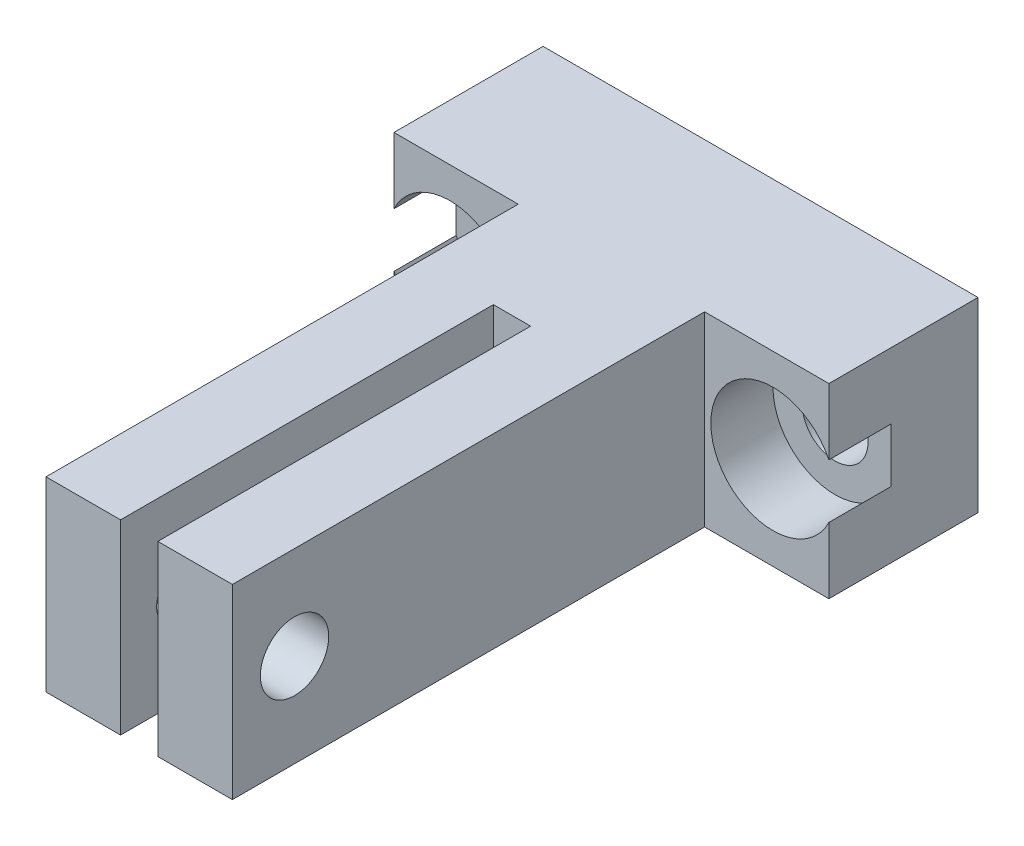
ISO-10303-21;
HEADER;
FILE_DESCRIPTION(('STEP AP214'),'2;1');
FILE_NAME('part.step','',(''),(''),'','','');
FILE_SCHEMA(('AUTOMOTIVE_DESIGN { 1 0 10303 214 1 1 1 1 }'));
ENDSEC;
DATA;
#1=APPLICATION_CONTEXT('core data for automotive mechanical design processes');
#2=APPLICATION_PROTOCOL_DEFINITION('international standard','automotive_design',2000,#1);
#3=PRODUCT_CONTEXT('',#1,'mechanical');
#4=PRODUCT('Part','Part','',(#3));
#5=PRODUCT_RELATED_PRODUCT_CATEGORY('part','',(#4));
#6=PRODUCT_DEFINITION_FORMATION('','',#4);
#7=PRODUCT_DEFINITION_CONTEXT('part definition',#1,'design');
#8=PRODUCT_DEFINITION('design','',#6,#7);
#9=PRODUCT_DEFINITION_SHAPE('','',#8);
#10=(LENGTH_UNIT() NAMED_UNIT(*) SI_UNIT(.MILLI.,.METRE.));
#11=(NAMED_UNIT(*) PLANE_ANGLE_UNIT() SI_UNIT($,.RADIAN.));
#12=(NAMED_UNIT(*) SI_UNIT($,.STERADIAN.) SOLID_ANGLE_UNIT());
#13=UNCERTAINTY_MEASURE_WITH_UNIT(LENGTH_MEASURE(1.E-05),#10,'distance_accuracy_value','');
#14=(GEOMETRIC_REPRESENTATION_CONTEXT(3) GLOBAL_UNCERTAINTY_ASSIGNED_CONTEXT((#13)) GLOBAL_UNIT_ASSIGNED_CONTEXT((#10,
#11,#12)) REPRESENTATION_CONTEXT('',''));
#15=CARTESIAN_POINT('',(0.,0.,0.));
#16=DIRECTION('',(0.,0.,1.));
#17=DIRECTION('',(1.,0.,0.));
#18=AXIS2_PLACEMENT_3D('',#15,#16,#17);
#19=CARTESIAN_POINT('',(0.,0.,12.));
#20=DIRECTION('',(0.,0.,-1.));
#21=DIRECTION('',(-1.,0.,0.));
#22=AXIS2_PLACEMENT_3D('',#19,#20,#21);
#23=PLANE('',#22);
#24=CARTESIAN_POINT('',(-173.,-19.5,12.));
#25=DIRECTION('',(0.,0.,1.));
#26=DIRECTION('',(1.,0.,0.));
#27=AXIS2_PLACEMENT_3D('',#24,#25,#26);
#28=CIRCLE('',#27,5.);
#29=CARTESIAN_POINT('',(-168.5,-17.3205505282297,12.));
#30=VERTEX_POINT('',#29);
#31=CARTESIAN_POINT('',(-168.5,-21.6794494717703,12.));
#32=VERTEX_POINT('',#31);
#33=EDGE_CURVE('E165',#30,#32,#28,.T.);
#34=ORIENTED_EDGE('',*,*,#33,.F.);
#35=DIRECTION('',(0.,-1.,0.));
#36=VECTOR('',#35,1.);
#37=CARTESIAN_POINT('',(-168.5,-27.,12.));
#38=LINE('',#37,#36);
#39=CARTESIAN_POINT('',(-168.5,-12.,12.));
#40=VERTEX_POINT('',#39);
#41=EDGE_CURVE('E232',#40,#30,#38,.T.);
#42=ORIENTED_EDGE('',*,*,#41,.F.);
#43=DIRECTION('',(1.,0.,0.));
#44=VECTOR('',#43,1.);
#45=CARTESIAN_POINT('',(-178.5,-12.,12.));
#46=LINE('',#45,#44);
#47=CARTESIAN_POINT('',(-178.5,-12.,12.));
#48=VERTEX_POINT('',#47);
#49=EDGE_CURVE('E237',#48,#40,#46,.T.);
#50=ORIENTED_EDGE('',*,*,#49,.F.);
#51=DIRECTION('',(0.,1.,0.));
#52=VECTOR('',#51,1.);
#53=CARTESIAN_POINT('',(-178.5,-27.,12.));
#54=LINE('',#53,#52);
#55=CARTESIAN_POINT('',(-178.5,-27.,12.));
#56=VERTEX_POINT('',#55);
#57=EDGE_CURVE('E225',#56,#48,#54,.T.);
#58=ORIENTED_EDGE('',*,*,#57,.F.);
#59=DIRECTION('',(-1.,0.,0.));
#60=VECTOR('',#59,1.);
#61=CARTESIAN_POINT('',(-178.5,-27.,12.));
#62=LINE('',#61,#60);
#63=CARTESIAN_POINT('',(-168.5,-27.,12.));
#64=VERTEX_POINT('',#63);
#65=EDGE_CURVE('E246',#64,#56,#62,.T.);
#66=ORIENTED_EDGE('',*,*,#65,.F.);
#67=EDGE_CURVE('E243',#32,#64,#38,.T.);
#68=ORIENTED_EDGE('',*,*,#67,.F.);
#69=EDGE_LOOP('',(#34,#42,#50,#58,#66,#68));
#70=FACE_BOUND('',#69,.T.);
#71=ADVANCED_FACE('F34',(#70),#23,.F.);
#72=CARTESIAN_POINT('',(0.,0.,50.));
#73=DIRECTION('',(0.,0.,-1.));
#74=DIRECTION('',(-1.,0.,0.));
#75=AXIS2_PLACEMENT_3D('',#72,#73,#74);
#76=PLANE('',#75);
#77=DIRECTION('',(1.,0.,0.));
#78=VECTOR('',#77,1.);
#79=CARTESIAN_POINT('',(-193.5,-27.,50.));
#80=LINE('',#79,#78);
#81=CARTESIAN_POINT('',(-193.5,-27.,50.));
#82=VERTEX_POINT('',#81);
#83=CARTESIAN_POINT('',(-187.5,-27.,50.));
#84=VERTEX_POINT('',#83);
#85=EDGE_CURVE('E272',#82,#84,#80,.T.);
#86=ORIENTED_EDGE('',*,*,#85,.T.);
#87=DIRECTION('',(0.,-1.,0.));
#88=VECTOR('',#87,1.);
#89=CARTESIAN_POINT('',(-187.5,-12.,50.));
#90=LINE('',#89,#88);
#91=CARTESIAN_POINT('',(-187.5,-12.,50.));
#92=VERTEX_POINT('',#91);
#93=EDGE_CURVE('E291',#92,#84,#90,.T.);
#94=ORIENTED_EDGE('',*,*,#93,.F.);
#95=DIRECTION('',(-1.,0.,0.));
#96=VECTOR('',#95,1.);
#97=CARTESIAN_POINT('',(-193.5,-12.,50.));
#98=LINE('',#97,#96);
#99=CARTESIAN_POINT('',(-193.5,-12.,50.));
#100=VERTEX_POINT('',#99);
#101=EDGE_CURVE('E269',#92,#100,#98,.T.);
#102=ORIENTED_EDGE('',*,*,#101,.T.);
#103=DIRECTION('',(0.,-1.,0.));
#104=VECTOR('',#103,1.);
#105=CARTESIAN_POINT('',(-193.5,-27.,50.));
#106=LINE('',#105,#104);
#107=EDGE_CURVE('E262',#100,#82,#106,.T.);
#108=ORIENTED_EDGE('',*,*,#107,.T.);
#109=EDGE_LOOP('',(#86,#94,#102,#108));
#110=FACE_BOUND('',#109,.T.);
#111=ADVANCED_FACE('F338',(#110),#76,.F.);
#112=CARTESIAN_POINT('',(-193.5,-27.,50.));
#113=DIRECTION('',(1.,0.,0.));
#114=DIRECTION('',(0.,0.,-1.));
#115=AXIS2_PLACEMENT_3D('',#112,#113,#114);
#116=PLANE('',#115);
#117=CARTESIAN_POINT('',(-193.5,-19.4999999999997,45.));
#118=DIRECTION('',(1.,0.,0.));
#119=DIRECTION('',(0.,0.,-1.));
#120=AXIS2_PLACEMENT_3D('',#117,#118,#119);
#121=CIRCLE('',#120,2.09999999999999);
#122=CARTESIAN_POINT('',(-193.5,-19.4999999999997,42.9));
#123=VERTEX_POINT('',#122);
#124=EDGE_CURVE('E401',#123,#123,#121,.T.);
#125=ORIENTED_EDGE('',*,*,#124,.T.);
#126=EDGE_LOOP('',(#125));
#127=FACE_BOUND('',#126,.T.);
#128=DIRECTION('',(0.,0.,-1.));
#129=VECTOR('',#128,1.);
#130=CARTESIAN_POINT('',(-193.5,-12.,50.));
#131=LINE('',#130,#129);
#132=CARTESIAN_POINT('',(-193.5,-12.,12.));
#133=VERTEX_POINT('',#132);
#134=EDGE_CURVE('E195',#100,#133,#131,.T.);
#135=ORIENTED_EDGE('',*,*,#134,.T.);
#136=DIRECTION('',(0.,-1.,0.));
#137=VECTOR('',#136,1.);
#138=CARTESIAN_POINT('',(-193.5,-27.,12.));
#139=LINE('',#138,#137);
#140=CARTESIAN_POINT('',(-193.5,-27.,12.));
#141=VERTEX_POINT('',#140);
#142=EDGE_CURVE('E190',#133,#141,#139,.T.);
#143=ORIENTED_EDGE('',*,*,#142,.T.);
#144=DIRECTION('',(0.,0.,-1.));
#145=VECTOR('',#144,1.);
#146=CARTESIAN_POINT('',(-193.5,-27.,50.));
#147=LINE('',#146,#145);
#148=EDGE_CURVE('E207',#82,#141,#147,.T.);
#149=ORIENTED_EDGE('',*,*,#148,.F.);
#150=ORIENTED_EDGE('',*,*,#107,.F.);
#151=EDGE_LOOP('',(#135,#143,#149,#150));
#152=FACE_BOUND('',#151,.T.);
#153=ADVANCED_FACE('F36',(#127,#152),#116,.F.);
#154=CARTESIAN_POINT('',(-193.5,-27.,50.));
#155=DIRECTION('',(0.,1.,0.));
#156=DIRECTION('',(0.,0.,1.));
#157=AXIS2_PLACEMENT_3D('',#154,#155,#156);
#158=PLANE('',#157);
#159=DIRECTION('',(1.,0.,0.));
#160=VECTOR('',#159,1.);
#161=CARTESIAN_POINT('',(-187.5,-27.,20.));
#162=LINE('',#161,#160);
#163=CARTESIAN_POINT('',(-187.5,-27.,20.));
#164=VERTEX_POINT('',#163);
#165=CARTESIAN_POINT('',(-184.5,-27.,20.));
#166=VERTEX_POINT('',#165);
#167=EDGE_CURVE('E299',#164,#166,#162,.T.);
#168=ORIENTED_EDGE('',*,*,#167,.F.);
#169=DIRECTION('',(0.,0.,1.));
#170=VECTOR('',#169,1.);
#171=CARTESIAN_POINT('',(-187.5,-27.,20.));
#172=LINE('',#171,#170);
#173=EDGE_CURVE('E278',#164,#84,#172,.T.);
#174=ORIENTED_EDGE('',*,*,#173,.T.);
#175=ORIENTED_EDGE('',*,*,#85,.F.);
#176=ORIENTED_EDGE('',*,*,#148,.T.);
#177=DIRECTION('',(-1.,0.,0.));
#178=VECTOR('',#177,1.);
#179=CARTESIAN_POINT('',(-193.5,-27.,12.));
#180=LINE('',#179,#178);
#181=CARTESIAN_POINT('',(-203.5,-27.,12.));
#182=VERTEX_POINT('',#181);
#183=EDGE_CURVE('E198',#141,#182,#180,.T.);
#184=ORIENTED_EDGE('',*,*,#183,.T.);
#185=DIRECTION('',(0.,0.,-1.));
#186=VECTOR('',#185,1.);
#187=CARTESIAN_POINT('',(-203.5,-27.,12.));
#188=LINE('',#187,#186);
#189=CARTESIAN_POINT('',(-203.5,-27.,0.));
#190=VERTEX_POINT('',#189);
#191=EDGE_CURVE('E194',#182,#190,#188,.T.);
#192=ORIENTED_EDGE('',*,*,#191,.T.);
#193=DIRECTION('',(1.,0.,0.));
#194=VECTOR('',#193,1.);
#195=CARTESIAN_POINT('',(-193.5,-27.,0.));
#196=LINE('',#195,#194);
#197=CARTESIAN_POINT('',(-168.5,-27.,0.));
#198=VERTEX_POINT('',#197);
#199=EDGE_CURVE('E263',#190,#198,#196,.T.);
#200=ORIENTED_EDGE('',*,*,#199,.T.);
#201=DIRECTION('',(0.,0.,-1.));
#202=VECTOR('',#201,1.);
#203=CARTESIAN_POINT('',(-168.5,-27.,12.));
#204=LINE('',#203,#202);
#205=EDGE_CURVE('E293',#64,#198,#204,.T.);
#206=ORIENTED_EDGE('',*,*,#205,.F.);
#207=ORIENTED_EDGE('',*,*,#65,.T.);
#208=DIRECTION('',(0.,0.,-1.));
#209=VECTOR('',#208,1.);
#210=CARTESIAN_POINT('',(-178.5,-27.,50.));
#211=LINE('',#210,#209);
#212=CARTESIAN_POINT('',(-178.5,-27.,50.));
#213=VERTEX_POINT('',#212);
#214=EDGE_CURVE('E238',#213,#56,#211,.T.);
#215=ORIENTED_EDGE('',*,*,#214,.F.);
#216=CARTESIAN_POINT('',(-184.5,-27.,50.));
#217=VERTEX_POINT('',#216);
#218=EDGE_CURVE('E275',#217,#213,#80,.T.);
#219=ORIENTED_EDGE('',*,*,#218,.F.);
#220=DIRECTION('',(0.,0.,1.));
#221=VECTOR('',#220,1.);
#222=CARTESIAN_POINT('',(-184.5,-27.,20.));
#223=LINE('',#222,#221);
#224=EDGE_CURVE('E281',#166,#217,#223,.T.);
#225=ORIENTED_EDGE('',*,*,#224,.F.);
#226=EDGE_LOOP('',(#168,#174,#175,#176,#184,#192,#200,#206,#207,#215,#219,#225));
#227=FACE_BOUND('',#226,.T.);
#228=ADVANCED_FACE('F371',(#227),#158,.F.);
#229=CARTESIAN_POINT('',(-178.5,-27.,50.));
#230=DIRECTION('',(-1.,0.,0.));
#231=DIRECTION('',(0.,0.,1.));
#232=AXIS2_PLACEMENT_3D('',#229,#230,#231);
#233=PLANE('',#232);
#234=CARTESIAN_POINT('',(-178.5,-19.5,45.));
#235=DIRECTION('',(1.,0.,0.));
#236=DIRECTION('',(0.,0.,-1.));
#237=AXIS2_PLACEMENT_3D('',#234,#235,#236);
#238=CIRCLE('',#237,2.75);
#239=CARTESIAN_POINT('',(-178.5,-19.5,42.25));
#240=VERTEX_POINT('',#239);
#241=EDGE_CURVE('E159',#240,#240,#238,.T.);
#242=ORIENTED_EDGE('',*,*,#241,.F.);
#243=EDGE_LOOP('',(#242));
#244=FACE_BOUND('',#243,.T.);
#245=ORIENTED_EDGE('',*,*,#214,.T.);
#246=ORIENTED_EDGE('',*,*,#57,.T.);
#247=DIRECTION('',(0.,0.,-1.));
#248=VECTOR('',#247,1.);
#249=CARTESIAN_POINT('',(-178.5,-12.,50.));
#250=LINE('',#249,#248);
#251=CARTESIAN_POINT('',(-178.5,-12.,50.));
#252=VERTEX_POINT('',#251);
#253=EDGE_CURVE('E256',#252,#48,#250,.T.);
#254=ORIENTED_EDGE('',*,*,#253,.F.);
#255=DIRECTION('',(0.,1.,0.));
#256=VECTOR('',#255,1.);
#257=CARTESIAN_POINT('',(-178.5,-27.,50.));
#258=LINE('',#257,#256);
#259=EDGE_CURVE('E270',#213,#252,#258,.T.);
#260=ORIENTED_EDGE('',*,*,#259,.F.);
#261=EDGE_LOOP('',(#245,#246,#254,#260));
#262=FACE_BOUND('',#261,.T.);
#263=ADVANCED_FACE('F369',(#244,#262),#233,.F.);
#264=CARTESIAN_POINT('',(-193.5,-12.,50.));
#265=DIRECTION('',(0.,-1.,0.));
#266=DIRECTION('',(1.,0.,0.));
#267=AXIS2_PLACEMENT_3D('',#264,#265,#266);
#268=PLANE('',#267);
#269=ORIENTED_EDGE('',*,*,#101,.F.);
#270=DIRECTION('',(0.,0.,1.));
#271=VECTOR('',#270,1.);
#272=CARTESIAN_POINT('',(-187.5,-12.,20.));
#273=LINE('',#272,#271);
#274=CARTESIAN_POINT('',(-187.5,-12.,20.));
#275=VERTEX_POINT('',#274);
#276=EDGE_CURVE('E265',#275,#92,#273,.T.);
#277=ORIENTED_EDGE('',*,*,#276,.F.);
#278=DIRECTION('',(-1.,0.,0.));
#279=VECTOR('',#278,1.);
#280=CARTESIAN_POINT('',(-187.5,-12.,20.));
#281=LINE('',#280,#279);
#282=CARTESIAN_POINT('',(-184.5,-12.,20.));
#283=VERTEX_POINT('',#282);
#284=EDGE_CURVE('E282',#283,#275,#281,.T.);
#285=ORIENTED_EDGE('',*,*,#284,.F.);
#286=DIRECTION('',(0.,0.,1.));
#287=VECTOR('',#286,1.);
#288=CARTESIAN_POINT('',(-184.5,-12.,20.));
#289=LINE('',#288,#287);
#290=CARTESIAN_POINT('',(-184.5,-12.,50.));
#291=VERTEX_POINT('',#290);
#292=EDGE_CURVE('E284',#283,#291,#289,.T.);
#293=ORIENTED_EDGE('',*,*,#292,.T.);
#294=EDGE_CURVE('E266',#252,#291,#98,.T.);
#295=ORIENTED_EDGE('',*,*,#294,.F.);
#296=ORIENTED_EDGE('',*,*,#253,.T.);
#297=ORIENTED_EDGE('',*,*,#49,.T.);
#298=DIRECTION('',(0.,0.,-1.));
#299=VECTOR('',#298,1.);
#300=CARTESIAN_POINT('',(-168.5,-12.,12.));
#301=LINE('',#300,#299);
#302=CARTESIAN_POINT('',(-168.5,-12.,0.));
#303=VERTEX_POINT('',#302);
#304=EDGE_CURVE('E249',#40,#303,#301,.T.);
#305=ORIENTED_EDGE('',*,*,#304,.T.);
#306=DIRECTION('',(-1.,0.,0.));
#307=VECTOR('',#306,1.);
#308=CARTESIAN_POINT('',(-193.5,-12.,0.));
#309=LINE('',#308,#307);
#310=CARTESIAN_POINT('',(-203.5,-12.,0.));
#311=VERTEX_POINT('',#310);
#312=EDGE_CURVE('E222',#303,#311,#309,.T.);
#313=ORIENTED_EDGE('',*,*,#312,.T.);
#314=DIRECTION('',(0.,0.,-1.));
#315=VECTOR('',#314,1.);
#316=CARTESIAN_POINT('',(-203.5,-12.,12.));
#317=LINE('',#316,#315);
#318=CARTESIAN_POINT('',(-203.5,-12.,12.));
#319=VERTEX_POINT('',#318);
#320=EDGE_CURVE('E215',#319,#311,#317,.T.);
#321=ORIENTED_EDGE('',*,*,#320,.F.);
#322=DIRECTION('',(1.,0.,0.));
#323=VECTOR('',#322,1.);
#324=CARTESIAN_POINT('',(-193.5,-12.,12.));
#325=LINE('',#324,#323);
#326=EDGE_CURVE('E184',#319,#133,#325,.T.);
#327=ORIENTED_EDGE('',*,*,#326,.T.);
#328=ORIENTED_EDGE('',*,*,#134,.F.);
#329=EDGE_LOOP('',(#269,#277,#285,#293,#295,#296,#297,#305,#313,#321,#327,#328));
#330=FACE_BOUND('',#329,.T.);
#331=ADVANCED_FACE('F219',(#330),#268,.F.);
#332=ORIENTED_EDGE('',*,*,#294,.T.);
#333=DIRECTION('',(0.,1.,0.));
#334=VECTOR('',#333,1.);
#335=CARTESIAN_POINT('',(-184.5,-12.,50.));
#336=LINE('',#335,#334);
#337=EDGE_CURVE('E288',#217,#291,#336,.T.);
#338=ORIENTED_EDGE('',*,*,#337,.F.);
#339=ORIENTED_EDGE('',*,*,#218,.T.);
#340=ORIENTED_EDGE('',*,*,#259,.T.);
#341=EDGE_LOOP('',(#332,#338,#339,#340));
#342=FACE_BOUND('',#341,.T.);
#343=ADVANCED_FACE('F345',(#342),#76,.F.);
#344=CARTESIAN_POINT('',(0.,0.,0.));
#345=DIRECTION('',(0.,0.,-1.));
#346=DIRECTION('',(-1.,0.,0.));
#347=AXIS2_PLACEMENT_3D('',#344,#345,#346);
#348=PLANE('',#347);
#349=CARTESIAN_POINT('',(-199.,-19.5,0.));
#350=DIRECTION('',(0.,0.,1.));
#351=DIRECTION('',(1.,0.,0.));
#352=AXIS2_PLACEMENT_3D('',#349,#350,#351);
#353=CIRCLE('',#352,2.64999999999999);
#354=CARTESIAN_POINT('',(-196.35,-19.5,0.));
#355=VERTEX_POINT('',#354);
#356=EDGE_CURVE('E153',#355,#355,#353,.T.);
#357=ORIENTED_EDGE('',*,*,#356,.T.);
#358=EDGE_LOOP('',(#357));
#359=FACE_BOUND('',#358,.T.);
#360=CARTESIAN_POINT('',(-173.,-19.5,0.));
#361=DIRECTION('',(0.,0.,1.));
#362=DIRECTION('',(1.,0.,0.));
#363=AXIS2_PLACEMENT_3D('',#360,#361,#362);
#364=CIRCLE('',#363,2.64999999999999);
#365=CARTESIAN_POINT('',(-170.35,-19.5,0.));
#366=VERTEX_POINT('',#365);
#367=EDGE_CURVE('E176',#366,#366,#364,.T.);
#368=ORIENTED_EDGE('',*,*,#367,.T.);
#369=EDGE_LOOP('',(#368));
#370=FACE_BOUND('',#369,.T.);
#371=ORIENTED_EDGE('',*,*,#199,.F.);
#372=DIRECTION('',(0.,1.,0.));
#373=VECTOR('',#372,1.);
#374=CARTESIAN_POINT('',(-203.5,-27.,0.));
#375=LINE('',#374,#373);
#376=EDGE_CURVE('E182',#190,#311,#375,.T.);
#377=ORIENTED_EDGE('',*,*,#376,.T.);
#378=ORIENTED_EDGE('',*,*,#312,.F.);
#379=DIRECTION('',(0.,-1.,0.));
#380=VECTOR('',#379,1.);
#381=CARTESIAN_POINT('',(-168.5,-27.,0.));
#382=LINE('',#381,#380);
#383=EDGE_CURVE('E223',#303,#198,#382,.T.);
#384=ORIENTED_EDGE('',*,*,#383,.T.);
#385=EDGE_LOOP('',(#371,#377,#378,#384));
#386=FACE_BOUND('',#385,.T.);
#387=ADVANCED_FACE('F315',(#359,#370,#386),#348,.T.);
#388=CARTESIAN_POINT('',(-187.5,-12.,20.));
#389=DIRECTION('',(-1.,0.,0.));
#390=DIRECTION('',(0.,-1.,0.));
#391=AXIS2_PLACEMENT_3D('',#388,#389,#390);
#392=PLANE('',#391);
#393=CARTESIAN_POINT('',(-187.5,-19.4999999999997,45.));
#394=DIRECTION('',(1.,0.,0.));
#395=DIRECTION('',(0.,0.,-1.));
#396=AXIS2_PLACEMENT_3D('',#393,#394,#395);
#397=CIRCLE('',#396,2.09999999999999);
#398=CARTESIAN_POINT('',(-187.5,-19.4999999999997,42.9));
#399=VERTEX_POINT('',#398);
#400=EDGE_CURVE('E404',#399,#399,#397,.T.);
#401=ORIENTED_EDGE('',*,*,#400,.F.);
#402=EDGE_LOOP('',(#401));
#403=FACE_BOUND('',#402,.T.);
#404=ORIENTED_EDGE('',*,*,#93,.T.);
#405=ORIENTED_EDGE('',*,*,#173,.F.);
#406=DIRECTION('',(0.,-1.,0.));
#407=VECTOR('',#406,1.);
#408=CARTESIAN_POINT('',(-187.5,-12.,20.));
#409=LINE('',#408,#407);
#410=EDGE_CURVE('E290',#275,#164,#409,.T.);
#411=ORIENTED_EDGE('',*,*,#410,.F.);
#412=ORIENTED_EDGE('',*,*,#276,.T.);
#413=EDGE_LOOP('',(#404,#405,#411,#412));
#414=FACE_BOUND('',#413,.T.);
#415=ADVANCED_FACE('F357',(#403,#414),#392,.F.);
#416=CARTESIAN_POINT('',(-184.5,-12.,20.));
#417=DIRECTION('',(1.,0.,0.));
#418=DIRECTION('',(0.,1.,0.));
#419=AXIS2_PLACEMENT_3D('',#416,#417,#418);
#420=PLANE('',#419);
#421=CARTESIAN_POINT('',(-184.5,-19.5,45.));
#422=DIRECTION('',(1.,0.,0.));
#423=DIRECTION('',(0.,1.,0.));
#424=AXIS2_PLACEMENT_3D('',#421,#422,#423);
#425=CIRCLE('',#424,2.75);
#426=CARTESIAN_POINT('',(-184.5,-16.75,45.));
#427=VERTEX_POINT('',#426);
#428=EDGE_CURVE('E403',#427,#427,#425,.F.);
#429=ORIENTED_EDGE('',*,*,#428,.F.);
#430=EDGE_LOOP('',(#429));
#431=FACE_BOUND('',#430,.T.);
#432=ORIENTED_EDGE('',*,*,#337,.T.);
#433=ORIENTED_EDGE('',*,*,#292,.F.);
#434=DIRECTION('',(0.,1.,0.));
#435=VECTOR('',#434,1.);
#436=CARTESIAN_POINT('',(-184.5,-12.,20.));
#437=LINE('',#436,#435);
#438=EDGE_CURVE('E296',#166,#283,#437,.T.);
#439=ORIENTED_EDGE('',*,*,#438,.F.);
#440=ORIENTED_EDGE('',*,*,#224,.T.);
#441=EDGE_LOOP('',(#432,#433,#439,#440));
#442=FACE_BOUND('',#441,.T.);
#443=ADVANCED_FACE('F353',(#431,#442),#420,.F.);
#444=CARTESIAN_POINT('',(0.,0.,20.));
#445=DIRECTION('',(0.,0.,1.));
#446=DIRECTION('',(1.,0.,0.));
#447=AXIS2_PLACEMENT_3D('',#444,#445,#446);
#448=PLANE('',#447);
#449=ORIENTED_EDGE('',*,*,#410,.T.);
#450=ORIENTED_EDGE('',*,*,#167,.T.);
#451=ORIENTED_EDGE('',*,*,#438,.T.);
#452=ORIENTED_EDGE('',*,*,#284,.T.);
#453=EDGE_LOOP('',(#449,#450,#451,#452));
#454=FACE_BOUND('',#453,.T.);
#455=ADVANCED_FACE('F350',(#454),#448,.T.);
#456=CARTESIAN_POINT('',(-168.5,-27.,12.));
#457=DIRECTION('',(1.,0.,0.));
#458=DIRECTION('',(0.,0.,-1.));
#459=AXIS2_PLACEMENT_3D('',#456,#457,#458);
#460=PLANE('',#459);
#461=DIRECTION('',(0.,0.,1.));
#462=VECTOR('',#461,1.);
#463=CARTESIAN_POINT('',(-168.5,-17.3205505282297,12.));
#464=LINE('',#463,#462);
#465=CARTESIAN_POINT('',(-168.5,-17.3205505282297,7.));
#466=VERTEX_POINT('',#465);
#467=EDGE_CURVE('E57',#466,#30,#464,.T.);
#468=ORIENTED_EDGE('',*,*,#467,.F.);
#469=DIRECTION('',(0.,1.,0.));
#470=VECTOR('',#469,1.);
#471=CARTESIAN_POINT('',(-168.5,-27.,7.));
#472=LINE('',#471,#470);
#473=CARTESIAN_POINT('',(-168.5,-21.6794494717703,7.));
#474=VERTEX_POINT('',#473);
#475=EDGE_CURVE('E206',#474,#466,#472,.T.);
#476=ORIENTED_EDGE('',*,*,#475,.F.);
#477=DIRECTION('',(0.,0.,1.));
#478=VECTOR('',#477,1.);
#479=CARTESIAN_POINT('',(-168.5,-21.6794494717703,12.));
#480=LINE('',#479,#478);
#481=EDGE_CURVE('E179',#32,#474,#480,.F.);
#482=ORIENTED_EDGE('',*,*,#481,.F.);
#483=ORIENTED_EDGE('',*,*,#67,.T.);
#484=ORIENTED_EDGE('',*,*,#205,.T.);
#485=ORIENTED_EDGE('',*,*,#383,.F.);
#486=ORIENTED_EDGE('',*,*,#304,.F.);
#487=ORIENTED_EDGE('',*,*,#41,.T.);
#488=EDGE_LOOP('',(#468,#476,#482,#483,#484,#485,#486,#487));
#489=FACE_BOUND('',#488,.T.);
#490=ADVANCED_FACE('F309',(#489),#460,.T.);
#491=CARTESIAN_POINT('',(-203.5,-27.,12.));
#492=DIRECTION('',(-1.,0.,0.));
#493=DIRECTION('',(0.,0.,1.));
#494=AXIS2_PLACEMENT_3D('',#491,#492,#493);
#495=PLANE('',#494);
#496=DIRECTION('',(0.,0.,1.));
#497=VECTOR('',#496,1.);
#498=CARTESIAN_POINT('',(-203.5,-21.6794494717703,12.));
#499=LINE('',#498,#497);
#500=CARTESIAN_POINT('',(-203.5,-21.6794494717703,7.));
#501=VERTEX_POINT('',#500);
#502=CARTESIAN_POINT('',(-203.5,-21.6794494717703,12.));
#503=VERTEX_POINT('',#502);
#504=EDGE_CURVE('E49',#501,#503,#499,.T.);
#505=ORIENTED_EDGE('',*,*,#504,.F.);
#506=DIRECTION('',(0.,-1.,0.));
#507=VECTOR('',#506,1.);
#508=CARTESIAN_POINT('',(-203.5,-27.,7.));
#509=LINE('',#508,#507);
#510=CARTESIAN_POINT('',(-203.5,-17.3205505282297,7.));
#511=VERTEX_POINT('',#510);
#512=EDGE_CURVE('E11',#511,#501,#509,.T.);
#513=ORIENTED_EDGE('',*,*,#512,.F.);
#514=DIRECTION('',(0.,0.,1.));
#515=VECTOR('',#514,1.);
#516=CARTESIAN_POINT('',(-203.5,-17.3205505282297,12.));
#517=LINE('',#516,#515);
#518=CARTESIAN_POINT('',(-203.5,-17.3205505282297,12.));
#519=VERTEX_POINT('',#518);
#520=EDGE_CURVE('E146',#519,#511,#517,.F.);
#521=ORIENTED_EDGE('',*,*,#520,.F.);
#522=DIRECTION('',(0.,1.,0.));
#523=VECTOR('',#522,1.);
#524=CARTESIAN_POINT('',(-203.5,-27.,12.));
#525=LINE('',#524,#523);
#526=EDGE_CURVE('E185',#519,#319,#525,.T.);
#527=ORIENTED_EDGE('',*,*,#526,.T.);
#528=ORIENTED_EDGE('',*,*,#320,.T.);
#529=ORIENTED_EDGE('',*,*,#376,.F.);
#530=ORIENTED_EDGE('',*,*,#191,.F.);
#531=EDGE_CURVE('E164',#182,#503,#525,.T.);
#532=ORIENTED_EDGE('',*,*,#531,.T.);
#533=EDGE_LOOP('',(#505,#513,#521,#527,#528,#529,#530,#532));
#534=FACE_BOUND('',#533,.T.);
#535=ADVANCED_FACE('F161',(#534),#495,.T.);
#536=CARTESIAN_POINT('',(0.,0.,12.));
#537=DIRECTION('',(0.,0.,-1.));
#538=DIRECTION('',(-1.,0.,0.));
#539=AXIS2_PLACEMENT_3D('',#536,#537,#538);
#540=PLANE('',#539);
#541=ORIENTED_EDGE('',*,*,#526,.F.);
#542=CARTESIAN_POINT('',(-199.,-19.5,12.));
#543=DIRECTION('',(0.,0.,-1.));
#544=DIRECTION('',(-1.,0.,0.));
#545=AXIS2_PLACEMENT_3D('',#542,#543,#544);
#546=CIRCLE('',#545,5.);
#547=EDGE_CURVE('E42',#519,#503,#546,.T.);
#548=ORIENTED_EDGE('',*,*,#547,.T.);
#549=ORIENTED_EDGE('',*,*,#531,.F.);
#550=ORIENTED_EDGE('',*,*,#183,.F.);
#551=ORIENTED_EDGE('',*,*,#142,.F.);
#552=ORIENTED_EDGE('',*,*,#326,.F.);
#553=EDGE_LOOP('',(#541,#548,#549,#550,#551,#552));
#554=FACE_BOUND('',#553,.T.);
#555=ADVANCED_FACE('F209',(#554),#540,.F.);
#556=CARTESIAN_POINT('',(-173.,-19.5,12.));
#557=DIRECTION('',(0.,0.,1.));
#558=DIRECTION('',(1.,0.,0.));
#559=AXIS2_PLACEMENT_3D('',#556,#557,#558);
#560=CYLINDRICAL_SURFACE('',#559,2.65);
#561=ORIENTED_EDGE('',*,*,#367,.F.);
#562=EDGE_LOOP('',(#561));
#563=FACE_BOUND('',#562,.T.);
#564=CARTESIAN_POINT('',(-173.,-19.5,7.));
#565=DIRECTION('',(0.,0.,1.));
#566=DIRECTION('',(1.,0.,0.));
#567=AXIS2_PLACEMENT_3D('',#564,#565,#566);
#568=CIRCLE('',#567,2.65000000000001);
#569=CARTESIAN_POINT('',(-170.35,-19.5,7.));
#570=VERTEX_POINT('',#569);
#571=EDGE_CURVE('E173',#570,#570,#568,.T.);
#572=ORIENTED_EDGE('',*,*,#571,.T.);
#573=EDGE_LOOP('',(#572));
#574=FACE_BOUND('',#573,.T.);
#575=ADVANCED_FACE('F325',(#563,#574),#560,.F.);
#576=CARTESIAN_POINT('',(-170.35,-19.5,7.));
#577=DIRECTION('',(0.,0.,-1.));
#578=DIRECTION('',(-1.,0.,0.));
#579=AXIS2_PLACEMENT_3D('',#576,#577,#578);
#580=PLANE('',#579);
#581=ORIENTED_EDGE('',*,*,#475,.T.);
#582=CARTESIAN_POINT('',(-173.,-19.5,7.));
#583=DIRECTION('',(0.,0.,1.));
#584=DIRECTION('',(1.,0.,0.));
#585=AXIS2_PLACEMENT_3D('',#582,#583,#584);
#586=CIRCLE('',#585,5.);
#587=EDGE_CURVE('E167',#466,#474,#586,.T.);
#588=ORIENTED_EDGE('',*,*,#587,.T.);
#589=EDGE_LOOP('',(#581,#588));
#590=FACE_BOUND('',#589,.T.);
#591=ORIENTED_EDGE('',*,*,#571,.F.);
#592=EDGE_LOOP('',(#591));
#593=FACE_BOUND('',#592,.T.);
#594=ADVANCED_FACE('F322',(#590,#593),#580,.F.);
#595=CARTESIAN_POINT('',(-173.,-19.5,12.));
#596=DIRECTION('',(0.,0.,1.));
#597=DIRECTION('',(1.,0.,0.));
#598=AXIS2_PLACEMENT_3D('',#595,#596,#597);
#599=CYLINDRICAL_SURFACE('',#598,5.);
#600=ORIENTED_EDGE('',*,*,#467,.T.);
#601=ORIENTED_EDGE('',*,*,#33,.T.);
#602=ORIENTED_EDGE('',*,*,#481,.T.);
#603=ORIENTED_EDGE('',*,*,#587,.F.);
#604=EDGE_LOOP('',(#600,#601,#602,#603));
#605=FACE_BOUND('',#604,.T.);
#606=ADVANCED_FACE('F319',(#605),#599,.F.);
#607=CARTESIAN_POINT('',(-199.,-19.5,12.));
#608=DIRECTION('',(0.,0.,1.));
#609=DIRECTION('',(1.,0.,0.));
#610=AXIS2_PLACEMENT_3D('',#607,#608,#609);
#611=CYLINDRICAL_SURFACE('',#610,2.65);
#612=ORIENTED_EDGE('',*,*,#356,.F.);
#613=EDGE_LOOP('',(#612));
#614=FACE_BOUND('',#613,.T.);
#615=CARTESIAN_POINT('',(-199.,-19.5,7.));
#616=DIRECTION('',(0.,0.,1.));
#617=DIRECTION('',(1.,0.,0.));
#618=AXIS2_PLACEMENT_3D('',#615,#616,#617);
#619=CIRCLE('',#618,2.65000000000001);
#620=CARTESIAN_POINT('',(-196.35,-19.5,7.));
#621=VERTEX_POINT('',#620);
#622=EDGE_CURVE('E158',#621,#621,#619,.T.);
#623=ORIENTED_EDGE('',*,*,#622,.T.);
#624=EDGE_LOOP('',(#623));
#625=FACE_BOUND('',#624,.T.);
#626=ADVANCED_FACE('F418',(#614,#625),#611,.F.);
#627=CARTESIAN_POINT('',(-196.35,-19.5,7.));
#628=DIRECTION('',(0.,0.,-1.));
#629=DIRECTION('',(-1.,0.,0.));
#630=AXIS2_PLACEMENT_3D('',#627,#628,#629);
#631=PLANE('',#630);
#632=ORIENTED_EDGE('',*,*,#512,.T.);
#633=CARTESIAN_POINT('',(-199.,-19.5,7.));
#634=DIRECTION('',(0.,0.,1.));
#635=DIRECTION('',(1.,0.,0.));
#636=AXIS2_PLACEMENT_3D('',#633,#634,#635);
#637=CIRCLE('',#636,5.);
#638=EDGE_CURVE('E149',#501,#511,#637,.T.);
#639=ORIENTED_EDGE('',*,*,#638,.T.);
#640=EDGE_LOOP('',(#632,#639));
#641=FACE_BOUND('',#640,.T.);
#642=ORIENTED_EDGE('',*,*,#622,.F.);
#643=EDGE_LOOP('',(#642));
#644=FACE_BOUND('',#643,.T.);
#645=ADVANCED_FACE('F156',(#641,#644),#631,.F.);
#646=CARTESIAN_POINT('',(-199.,-19.5,12.));
#647=DIRECTION('',(0.,0.,1.));
#648=DIRECTION('',(1.,0.,0.));
#649=AXIS2_PLACEMENT_3D('',#646,#647,#648);
#650=CYLINDRICAL_SURFACE('',#649,5.);
#651=ORIENTED_EDGE('',*,*,#504,.T.);
#652=ORIENTED_EDGE('',*,*,#547,.F.);
#653=ORIENTED_EDGE('',*,*,#520,.T.);
#654=ORIENTED_EDGE('',*,*,#638,.F.);
#655=EDGE_LOOP('',(#651,#652,#653,#654));
#656=FACE_BOUND('',#655,.T.);
#657=ADVANCED_FACE('F148',(#656),#650,.F.);
#658=CARTESIAN_POINT('',(-203.501025,-19.5,45.));
#659=DIRECTION('',(1.,0.,0.));
#660=DIRECTION('',(0.,0.,-1.));
#661=AXIS2_PLACEMENT_3D('',#658,#659,#660);
#662=CYLINDRICAL_SURFACE('',#661,2.75);
#663=ORIENTED_EDGE('',*,*,#241,.T.);
#664=EDGE_LOOP('',(#663));
#665=FACE_BOUND('',#664,.T.);
#666=ORIENTED_EDGE('',*,*,#428,.T.);
#667=EDGE_LOOP('',(#666));
#668=FACE_BOUND('',#667,.T.);
#669=ADVANCED_FACE('F428',(#665,#668),#662,.F.);
#670=CARTESIAN_POINT('',(-187.5,-19.4999999999997,45.));
#671=DIRECTION('',(1.,0.,0.));
#672=DIRECTION('',(0.,0.,-1.));
#673=AXIS2_PLACEMENT_3D('',#670,#671,#672);
#674=CYLINDRICAL_SURFACE('',#673,2.09999999999999);
#675=ORIENTED_EDGE('',*,*,#400,.T.);
#676=EDGE_LOOP('',(#675));
#677=FACE_BOUND('',#676,.T.);
#678=ORIENTED_EDGE('',*,*,#124,.F.);
#679=EDGE_LOOP('',(#678));
#680=FACE_BOUND('',#679,.T.);
#681=ADVANCED_FACE('F460',(#677,#680),#674,.F.);
#682=CLOSED_SHELL('',(#71,#111,#153,#228,#263,#331,#343,#387,#415,#443,#455,#490,#535,#555,#575,
#594,#606,#626,#645,#657,#669,#681));
#683=MANIFOLD_SOLID_BREP('B2',#682);
#684=ADVANCED_BREP_SHAPE_REPRESENTATION('',(#18,#683),#14);
#685=SHAPE_DEFINITION_REPRESENTATION(#9,#684);
ENDSEC;
END-ISO-10303-21;
